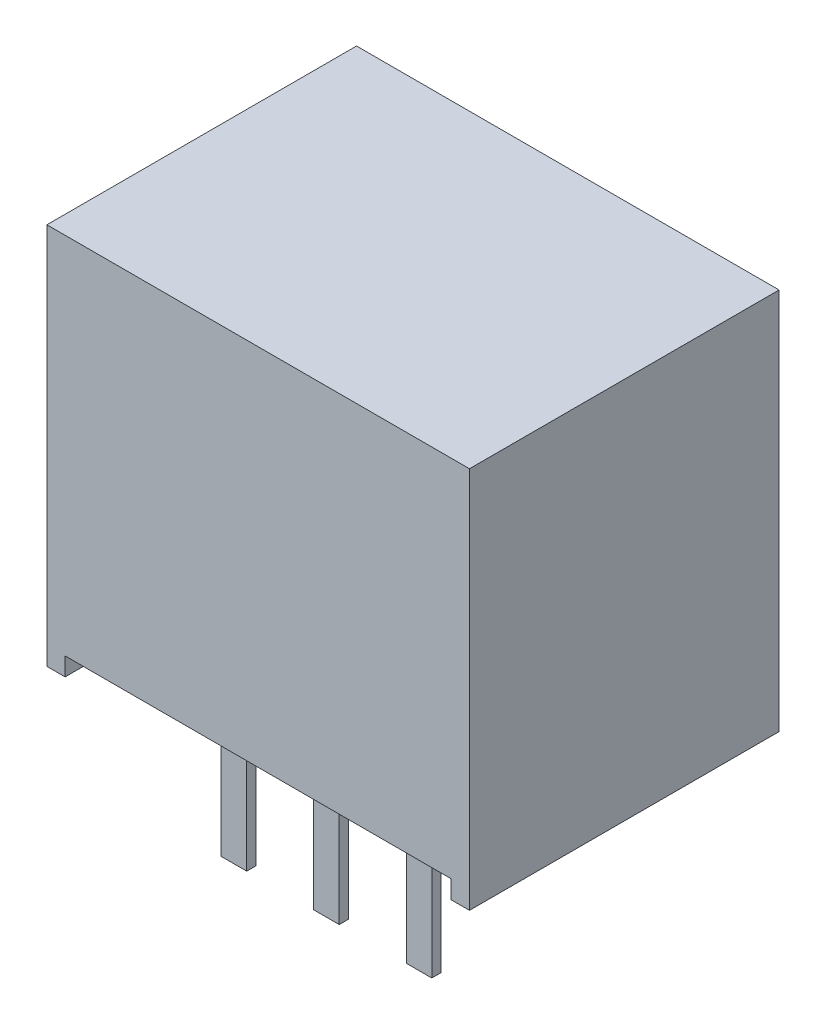
ISO-10303-21;
HEADER;
FILE_DESCRIPTION(('STEP AP214'),'2;1');
FILE_NAME('part.step','',(''),(''),'','','');
FILE_SCHEMA(('AUTOMOTIVE_DESIGN { 1 0 10303 214 1 1 1 1 }'));
ENDSEC;
DATA;
#1=APPLICATION_CONTEXT('core data for automotive mechanical design processes');
#2=APPLICATION_PROTOCOL_DEFINITION('international standard','automotive_design',2000,#1);
#3=PRODUCT_CONTEXT('',#1,'mechanical');
#4=PRODUCT('Part','Part','',(#3));
#5=PRODUCT_RELATED_PRODUCT_CATEGORY('part','',(#4));
#6=PRODUCT_DEFINITION_FORMATION('','',#4);
#7=PRODUCT_DEFINITION_CONTEXT('part definition',#1,'design');
#8=PRODUCT_DEFINITION('design','',#6,#7);
#9=PRODUCT_DEFINITION_SHAPE('','',#8);
#10=(LENGTH_UNIT() NAMED_UNIT(*) SI_UNIT(.MILLI.,.METRE.));
#11=(NAMED_UNIT(*) PLANE_ANGLE_UNIT() SI_UNIT($,.RADIAN.));
#12=(NAMED_UNIT(*) SI_UNIT($,.STERADIAN.) SOLID_ANGLE_UNIT());
#13=UNCERTAINTY_MEASURE_WITH_UNIT(LENGTH_MEASURE(1.E-05),#10,'distance_accuracy_value','');
#14=(GEOMETRIC_REPRESENTATION_CONTEXT(3) GLOBAL_UNCERTAINTY_ASSIGNED_CONTEXT((#13)) GLOBAL_UNIT_ASSIGNED_CONTEXT((#10,
#11,#12)) REPRESENTATION_CONTEXT('',''));
#15=CARTESIAN_POINT('',(0.,0.,0.));
#16=DIRECTION('',(0.,0.,1.));
#17=DIRECTION('',(1.,0.,0.));
#18=AXIS2_PLACEMENT_3D('',#15,#16,#17);
#19=CARTESIAN_POINT('',(-5.3,-4.75,-4.25));
#20=DIRECTION('',(0.,1.,0.));
#21=DIRECTION('',(0.,0.,1.));
#22=AXIS2_PLACEMENT_3D('',#19,#20,#21);
#23=PLANE('',#22);
#24=DIRECTION('',(0.,0.,1.));
#25=VECTOR('',#24,1.);
#26=CARTESIAN_POINT('',(-2.19,-4.75,2.125));
#27=LINE('',#26,#25);
#28=CARTESIAN_POINT('',(-2.19,-4.75,2.125));
#29=VERTEX_POINT('',#28);
#30=CARTESIAN_POINT('',(-2.19,-4.75,2.375));
#31=VERTEX_POINT('',#30);
#32=EDGE_CURVE('E194',#29,#31,#27,.T.);
#33=ORIENTED_EDGE('',*,*,#32,.F.);
#34=DIRECTION('',(1.,0.,0.));
#35=VECTOR('',#34,1.);
#36=CARTESIAN_POINT('',(-2.89,-4.75,2.125));
#37=LINE('',#36,#35);
#38=CARTESIAN_POINT('',(-2.89,-4.75,2.125));
#39=VERTEX_POINT('',#38);
#40=EDGE_CURVE('E207',#39,#29,#37,.T.);
#41=ORIENTED_EDGE('',*,*,#40,.F.);
#42=DIRECTION('',(0.,0.,-1.));
#43=VECTOR('',#42,1.);
#44=CARTESIAN_POINT('',(-2.89,-4.75,2.125));
#45=LINE('',#44,#43);
#46=CARTESIAN_POINT('',(-2.89,-4.75,2.375));
#47=VERTEX_POINT('',#46);
#48=EDGE_CURVE('E216',#47,#39,#45,.T.);
#49=ORIENTED_EDGE('',*,*,#48,.F.);
#50=DIRECTION('',(-1.,0.,0.));
#51=VECTOR('',#50,1.);
#52=CARTESIAN_POINT('',(-2.89,-4.75,2.375));
#53=LINE('',#52,#51);
#54=EDGE_CURVE('E197',#31,#47,#53,.T.);
#55=ORIENTED_EDGE('',*,*,#54,.F.);
#56=EDGE_LOOP('',(#33,#41,#49,#55));
#57=FACE_BOUND('',#56,.T.);
#58=DIRECTION('',(-1.,0.,0.));
#59=VECTOR('',#58,1.);
#60=CARTESIAN_POINT('',(-5.3,-4.75,4.25));
#61=LINE('',#60,#59);
#62=CARTESIAN_POINT('',(5.3,-4.75,4.25));
#63=VERTEX_POINT('',#62);
#64=CARTESIAN_POINT('',(-5.3,-4.75,4.25));
#65=VERTEX_POINT('',#64);
#66=EDGE_CURVE('E270',#63,#65,#61,.T.);
#67=ORIENTED_EDGE('',*,*,#66,.T.);
#68=DIRECTION('',(0.,0.,1.));
#69=VECTOR('',#68,1.);
#70=CARTESIAN_POINT('',(-5.3,-4.75,-4.25));
#71=LINE('',#70,#69);
#72=CARTESIAN_POINT('',(-5.3,-4.75,-4.25));
#73=VERTEX_POINT('',#72);
#74=EDGE_CURVE('E283',#73,#65,#71,.T.);
#75=ORIENTED_EDGE('',*,*,#74,.F.);
#76=DIRECTION('',(-1.,0.,0.));
#77=VECTOR('',#76,1.);
#78=CARTESIAN_POINT('',(-5.3,-4.75,-4.25));
#79=LINE('',#78,#77);
#80=CARTESIAN_POINT('',(5.3,-4.75,-4.25));
#81=VERTEX_POINT('',#80);
#82=EDGE_CURVE('E273',#81,#73,#79,.T.);
#83=ORIENTED_EDGE('',*,*,#82,.F.);
#84=DIRECTION('',(0.,0.,1.));
#85=VECTOR('',#84,1.);
#86=CARTESIAN_POINT('',(5.3,-4.75,-4.25));
#87=LINE('',#86,#85);
#88=EDGE_CURVE('E286',#81,#63,#87,.T.);
#89=ORIENTED_EDGE('',*,*,#88,.T.);
#90=EDGE_LOOP('',(#67,#75,#83,#89));
#91=FACE_BOUND('',#90,.T.);
#92=DIRECTION('',(0.,0.,1.));
#93=VECTOR('',#92,1.);
#94=CARTESIAN_POINT('',(0.35,-4.75,2.375));
#95=LINE('',#94,#93);
#96=CARTESIAN_POINT('',(0.35,-4.75,2.125));
#97=VERTEX_POINT('',#96);
#98=CARTESIAN_POINT('',(0.35,-4.75,2.375));
#99=VERTEX_POINT('',#98);
#100=EDGE_CURVE('E232',#97,#99,#95,.T.);
#101=ORIENTED_EDGE('',*,*,#100,.F.);
#102=DIRECTION('',(1.,0.,0.));
#103=VECTOR('',#102,1.);
#104=CARTESIAN_POINT('',(-0.35,-4.75,2.125));
#105=LINE('',#104,#103);
#106=CARTESIAN_POINT('',(-0.35,-4.75,2.125));
#107=VERTEX_POINT('',#106);
#108=EDGE_CURVE('E237',#107,#97,#105,.T.);
#109=ORIENTED_EDGE('',*,*,#108,.F.);
#110=DIRECTION('',(0.,0.,-1.));
#111=VECTOR('',#110,1.);
#112=CARTESIAN_POINT('',(-0.35,-4.75,2.375));
#113=LINE('',#112,#111);
#114=CARTESIAN_POINT('',(-0.35,-4.75,2.375));
#115=VERTEX_POINT('',#114);
#116=EDGE_CURVE('E249',#115,#107,#113,.T.);
#117=ORIENTED_EDGE('',*,*,#116,.F.);
#118=DIRECTION('',(-1.,0.,0.));
#119=VECTOR('',#118,1.);
#120=CARTESIAN_POINT('',(-0.35,-4.75,2.375));
#121=LINE('',#120,#119);
#122=EDGE_CURVE('E246',#99,#115,#121,.T.);
#123=ORIENTED_EDGE('',*,*,#122,.F.);
#124=EDGE_LOOP('',(#101,#109,#117,#123));
#125=FACE_BOUND('',#124,.T.);
#126=DIRECTION('',(0.,0.,-1.));
#127=VECTOR('',#126,1.);
#128=CARTESIAN_POINT('',(2.19,-4.75,2.125));
#129=LINE('',#128,#127);
#130=CARTESIAN_POINT('',(2.19,-4.75,2.375));
#131=VERTEX_POINT('',#130);
#132=CARTESIAN_POINT('',(2.19,-4.75,2.125));
#133=VERTEX_POINT('',#132);
#134=EDGE_CURVE('E193',#131,#133,#129,.T.);
#135=ORIENTED_EDGE('',*,*,#134,.F.);
#136=DIRECTION('',(-1.,0.,0.));
#137=VECTOR('',#136,1.);
#138=CARTESIAN_POINT('',(2.89,-4.75,2.375));
#139=LINE('',#138,#137);
#140=CARTESIAN_POINT('',(2.89,-4.75,2.375));
#141=VERTEX_POINT('',#140);
#142=EDGE_CURVE('E190',#141,#131,#139,.T.);
#143=ORIENTED_EDGE('',*,*,#142,.F.);
#144=DIRECTION('',(0.,0.,1.));
#145=VECTOR('',#144,1.);
#146=CARTESIAN_POINT('',(2.89,-4.75,2.125));
#147=LINE('',#146,#145);
#148=CARTESIAN_POINT('',(2.89,-4.75,2.125));
#149=VERTEX_POINT('',#148);
#150=EDGE_CURVE('E57',#149,#141,#147,.T.);
#151=ORIENTED_EDGE('',*,*,#150,.F.);
#152=DIRECTION('',(1.,0.,0.));
#153=VECTOR('',#152,1.);
#154=CARTESIAN_POINT('',(2.89,-4.75,2.125));
#155=LINE('',#154,#153);
#156=EDGE_CURVE('E52',#133,#149,#155,.T.);
#157=ORIENTED_EDGE('',*,*,#156,.F.);
#158=EDGE_LOOP('',(#135,#143,#151,#157));
#159=FACE_BOUND('',#158,.T.);
#160=ADVANCED_FACE('F35',(#57,#91,#125,#159),#23,.F.);
#161=CARTESIAN_POINT('',(-5.8,-5.25,4.25));
#162=DIRECTION('',(0.,1.,0.));
#163=DIRECTION('',(0.,0.,1.));
#164=AXIS2_PLACEMENT_3D('',#161,#162,#163);
#165=PLANE('',#164);
#166=DIRECTION('',(1.,0.,0.));
#167=VECTOR('',#166,1.);
#168=CARTESIAN_POINT('',(-5.8,-5.25,-4.25));
#169=LINE('',#168,#167);
#170=CARTESIAN_POINT('',(-5.8,-5.25,-4.25));
#171=VERTEX_POINT('',#170);
#172=CARTESIAN_POINT('',(-5.3,-5.25,-4.25));
#173=VERTEX_POINT('',#172);
#174=EDGE_CURVE('E296',#171,#173,#169,.T.);
#175=ORIENTED_EDGE('',*,*,#174,.T.);
#176=DIRECTION('',(0.,0.,1.));
#177=VECTOR('',#176,1.);
#178=CARTESIAN_POINT('',(-5.3,-5.25,-4.25));
#179=LINE('',#178,#177);
#180=CARTESIAN_POINT('',(-5.3,-5.25,4.25));
#181=VERTEX_POINT('',#180);
#182=EDGE_CURVE('E276',#173,#181,#179,.T.);
#183=ORIENTED_EDGE('',*,*,#182,.T.);
#184=DIRECTION('',(1.,0.,0.));
#185=VECTOR('',#184,1.);
#186=CARTESIAN_POINT('',(-5.8,-5.25,4.25));
#187=LINE('',#186,#185);
#188=CARTESIAN_POINT('',(-5.8,-5.25,4.25));
#189=VERTEX_POINT('',#188);
#190=EDGE_CURVE('E302',#189,#181,#187,.T.);
#191=ORIENTED_EDGE('',*,*,#190,.F.);
#192=DIRECTION('',(0.,0.,-1.));
#193=VECTOR('',#192,1.);
#194=CARTESIAN_POINT('',(-5.8,-5.25,4.25));
#195=LINE('',#194,#193);
#196=EDGE_CURVE('E11',#189,#171,#195,.T.);
#197=ORIENTED_EDGE('',*,*,#196,.T.);
#198=EDGE_LOOP('',(#175,#183,#191,#197));
#199=FACE_BOUND('',#198,.T.);
#200=ADVANCED_FACE('F332',(#199),#165,.F.);
#201=CARTESIAN_POINT('',(-5.8,-5.25,4.25));
#202=DIRECTION('',(-1.,0.,0.));
#203=DIRECTION('',(0.,0.,1.));
#204=AXIS2_PLACEMENT_3D('',#201,#202,#203);
#205=PLANE('',#204);
#206=DIRECTION('',(0.,1.,0.));
#207=VECTOR('',#206,1.);
#208=CARTESIAN_POINT('',(-5.8,-5.25,-4.25));
#209=LINE('',#208,#207);
#210=CARTESIAN_POINT('',(-5.8,5.25,-4.25));
#211=VERTEX_POINT('',#210);
#212=EDGE_CURVE('E285',#171,#211,#209,.T.);
#213=ORIENTED_EDGE('',*,*,#212,.F.);
#214=ORIENTED_EDGE('',*,*,#196,.F.);
#215=DIRECTION('',(0.,1.,0.));
#216=VECTOR('',#215,1.);
#217=CARTESIAN_POINT('',(-5.8,-5.25,4.25));
#218=LINE('',#217,#216);
#219=CARTESIAN_POINT('',(-5.8,5.25,4.25));
#220=VERTEX_POINT('',#219);
#221=EDGE_CURVE('E292',#189,#220,#218,.T.);
#222=ORIENTED_EDGE('',*,*,#221,.T.);
#223=DIRECTION('',(0.,0.,-1.));
#224=VECTOR('',#223,1.);
#225=CARTESIAN_POINT('',(-5.8,5.25,4.25));
#226=LINE('',#225,#224);
#227=EDGE_CURVE('E39',#220,#211,#226,.T.);
#228=ORIENTED_EDGE('',*,*,#227,.T.);
#229=EDGE_LOOP('',(#213,#214,#222,#228));
#230=FACE_BOUND('',#229,.T.);
#231=ADVANCED_FACE('F37',(#230),#205,.T.);
#232=CARTESIAN_POINT('',(5.3,-5.25,4.25));
#233=VERTEX_POINT('',#232);
#234=CARTESIAN_POINT('',(5.8,-5.25,4.25));
#235=VERTEX_POINT('',#234);
#236=EDGE_CURVE('E301',#233,#235,#187,.T.);
#237=ORIENTED_EDGE('',*,*,#236,.F.);
#238=DIRECTION('',(0.,0.,1.));
#239=VECTOR('',#238,1.);
#240=CARTESIAN_POINT('',(5.3,-5.25,-4.25));
#241=LINE('',#240,#239);
#242=CARTESIAN_POINT('',(5.3,-5.25,-4.25));
#243=VERTEX_POINT('',#242);
#244=EDGE_CURVE('E288',#243,#233,#241,.T.);
#245=ORIENTED_EDGE('',*,*,#244,.F.);
#246=CARTESIAN_POINT('',(5.8,-5.25,-4.25));
#247=VERTEX_POINT('',#246);
#248=EDGE_CURVE('E313',#243,#247,#169,.T.);
#249=ORIENTED_EDGE('',*,*,#248,.T.);
#250=DIRECTION('',(0.,0.,-1.));
#251=VECTOR('',#250,1.);
#252=CARTESIAN_POINT('',(5.8,-5.25,4.25));
#253=LINE('',#252,#251);
#254=EDGE_CURVE('E44',#235,#247,#253,.T.);
#255=ORIENTED_EDGE('',*,*,#254,.F.);
#256=EDGE_LOOP('',(#237,#245,#249,#255));
#257=FACE_BOUND('',#256,.T.);
#258=ADVANCED_FACE('F346',(#257),#165,.F.);
#259=CARTESIAN_POINT('',(5.8,-5.25,4.25));
#260=DIRECTION('',(-1.,0.,0.));
#261=DIRECTION('',(0.,0.,1.));
#262=AXIS2_PLACEMENT_3D('',#259,#260,#261);
#263=PLANE('',#262);
#264=DIRECTION('',(0.,1.,0.));
#265=VECTOR('',#264,1.);
#266=CARTESIAN_POINT('',(5.8,-5.25,-4.25));
#267=LINE('',#266,#265);
#268=CARTESIAN_POINT('',(5.8,5.25,-4.25));
#269=VERTEX_POINT('',#268);
#270=EDGE_CURVE('E310',#247,#269,#267,.T.);
#271=ORIENTED_EDGE('',*,*,#270,.T.);
#272=DIRECTION('',(0.,0.,-1.));
#273=VECTOR('',#272,1.);
#274=CARTESIAN_POINT('',(5.8,5.25,4.25));
#275=LINE('',#274,#273);
#276=CARTESIAN_POINT('',(5.8,5.25,4.25));
#277=VERTEX_POINT('',#276);
#278=EDGE_CURVE('E317',#277,#269,#275,.T.);
#279=ORIENTED_EDGE('',*,*,#278,.F.);
#280=DIRECTION('',(0.,1.,0.));
#281=VECTOR('',#280,1.);
#282=CARTESIAN_POINT('',(5.8,-5.25,4.25));
#283=LINE('',#282,#281);
#284=EDGE_CURVE('E299',#235,#277,#283,.T.);
#285=ORIENTED_EDGE('',*,*,#284,.F.);
#286=ORIENTED_EDGE('',*,*,#254,.T.);
#287=EDGE_LOOP('',(#271,#279,#285,#286));
#288=FACE_BOUND('',#287,.T.);
#289=ADVANCED_FACE('F342',(#288),#263,.F.);
#290=CARTESIAN_POINT('',(-5.8,5.25,4.25));
#291=DIRECTION('',(0.,1.,0.));
#292=DIRECTION('',(0.,0.,1.));
#293=AXIS2_PLACEMENT_3D('',#290,#291,#292);
#294=PLANE('',#293);
#295=DIRECTION('',(1.,0.,0.));
#296=VECTOR('',#295,1.);
#297=CARTESIAN_POINT('',(-5.8,5.25,-4.25));
#298=LINE('',#297,#296);
#299=EDGE_CURVE('E307',#211,#269,#298,.T.);
#300=ORIENTED_EDGE('',*,*,#299,.F.);
#301=ORIENTED_EDGE('',*,*,#227,.F.);
#302=DIRECTION('',(1.,0.,0.));
#303=VECTOR('',#302,1.);
#304=CARTESIAN_POINT('',(-5.8,5.25,4.25));
#305=LINE('',#304,#303);
#306=EDGE_CURVE('E295',#220,#277,#305,.T.);
#307=ORIENTED_EDGE('',*,*,#306,.T.);
#308=ORIENTED_EDGE('',*,*,#278,.T.);
#309=EDGE_LOOP('',(#300,#301,#307,#308));
#310=FACE_BOUND('',#309,.T.);
#311=ADVANCED_FACE('F325',(#310),#294,.T.);
#312=CARTESIAN_POINT('',(0.,0.,4.25));
#313=DIRECTION('',(0.,0.,-1.));
#314=DIRECTION('',(-1.,0.,0.));
#315=AXIS2_PLACEMENT_3D('',#312,#313,#314);
#316=PLANE('',#315);
#317=ORIENTED_EDGE('',*,*,#190,.T.);
#318=DIRECTION('',(0.,-1.,0.));
#319=VECTOR('',#318,1.);
#320=CARTESIAN_POINT('',(-5.3,-5.25,4.25));
#321=LINE('',#320,#319);
#322=EDGE_CURVE('E265',#65,#181,#321,.T.);
#323=ORIENTED_EDGE('',*,*,#322,.F.);
#324=ORIENTED_EDGE('',*,*,#66,.F.);
#325=DIRECTION('',(0.,1.,0.));
#326=VECTOR('',#325,1.);
#327=CARTESIAN_POINT('',(5.3,-5.25,4.25));
#328=LINE('',#327,#326);
#329=EDGE_CURVE('E278',#233,#63,#328,.T.);
#330=ORIENTED_EDGE('',*,*,#329,.F.);
#331=ORIENTED_EDGE('',*,*,#236,.T.);
#332=ORIENTED_EDGE('',*,*,#284,.T.);
#333=ORIENTED_EDGE('',*,*,#306,.F.);
#334=ORIENTED_EDGE('',*,*,#221,.F.);
#335=EDGE_LOOP('',(#317,#323,#324,#330,#331,#332,#333,#334));
#336=FACE_BOUND('',#335,.T.);
#337=ADVANCED_FACE('F336',(#336),#316,.F.);
#338=CARTESIAN_POINT('',(0.,0.,-4.25));
#339=DIRECTION('',(0.,0.,-1.));
#340=DIRECTION('',(-1.,0.,0.));
#341=AXIS2_PLACEMENT_3D('',#338,#339,#340);
#342=PLANE('',#341);
#343=DIRECTION('',(0.,-1.,0.));
#344=VECTOR('',#343,1.);
#345=CARTESIAN_POINT('',(-5.3,-5.25,-4.25));
#346=LINE('',#345,#344);
#347=EDGE_CURVE('E266',#73,#173,#346,.T.);
#348=ORIENTED_EDGE('',*,*,#347,.T.);
#349=ORIENTED_EDGE('',*,*,#174,.F.);
#350=ORIENTED_EDGE('',*,*,#212,.T.);
#351=ORIENTED_EDGE('',*,*,#299,.T.);
#352=ORIENTED_EDGE('',*,*,#270,.F.);
#353=ORIENTED_EDGE('',*,*,#248,.F.);
#354=DIRECTION('',(0.,1.,0.));
#355=VECTOR('',#354,1.);
#356=CARTESIAN_POINT('',(5.3,-5.25,-4.25));
#357=LINE('',#356,#355);
#358=EDGE_CURVE('E269',#243,#81,#357,.T.);
#359=ORIENTED_EDGE('',*,*,#358,.T.);
#360=ORIENTED_EDGE('',*,*,#82,.T.);
#361=EDGE_LOOP('',(#348,#349,#350,#351,#352,#353,#359,#360));
#362=FACE_BOUND('',#361,.T.);
#363=ADVANCED_FACE('F329',(#362),#342,.T.);
#364=CARTESIAN_POINT('',(-5.3,-5.25,-4.25));
#365=DIRECTION('',(-1.,0.,0.));
#366=DIRECTION('',(0.,0.,1.));
#367=AXIS2_PLACEMENT_3D('',#364,#365,#366);
#368=PLANE('',#367);
#369=ORIENTED_EDGE('',*,*,#322,.T.);
#370=ORIENTED_EDGE('',*,*,#182,.F.);
#371=ORIENTED_EDGE('',*,*,#347,.F.);
#372=ORIENTED_EDGE('',*,*,#74,.T.);
#373=EDGE_LOOP('',(#369,#370,#371,#372));
#374=FACE_BOUND('',#373,.T.);
#375=ADVANCED_FACE('F354',(#374),#368,.F.);
#376=CARTESIAN_POINT('',(5.3,-5.25,-4.25));
#377=DIRECTION('',(1.,0.,0.));
#378=DIRECTION('',(0.,0.,-1.));
#379=AXIS2_PLACEMENT_3D('',#376,#377,#378);
#380=PLANE('',#379);
#381=ORIENTED_EDGE('',*,*,#329,.T.);
#382=ORIENTED_EDGE('',*,*,#88,.F.);
#383=ORIENTED_EDGE('',*,*,#358,.F.);
#384=ORIENTED_EDGE('',*,*,#244,.T.);
#385=EDGE_LOOP('',(#381,#382,#383,#384));
#386=FACE_BOUND('',#385,.T.);
#387=ADVANCED_FACE('F348',(#386),#380,.F.);
#388=CARTESIAN_POINT('',(0.35,-9.25,2.375));
#389=DIRECTION('',(-1.,0.,0.));
#390=DIRECTION('',(0.,0.,1.));
#391=AXIS2_PLACEMENT_3D('',#388,#389,#390);
#392=PLANE('',#391);
#393=ORIENTED_EDGE('',*,*,#100,.T.);
#394=DIRECTION('',(0.,1.,0.));
#395=VECTOR('',#394,1.);
#396=CARTESIAN_POINT('',(0.35,-9.25,2.375));
#397=LINE('',#396,#395);
#398=CARTESIAN_POINT('',(0.35,-9.25,2.375));
#399=VERTEX_POINT('',#398);
#400=EDGE_CURVE('E262',#399,#99,#397,.T.);
#401=ORIENTED_EDGE('',*,*,#400,.F.);
#402=DIRECTION('',(0.,0.,1.));
#403=VECTOR('',#402,1.);
#404=CARTESIAN_POINT('',(0.35,-9.25,2.375));
#405=LINE('',#404,#403);
#406=CARTESIAN_POINT('',(0.35,-9.25,2.125));
#407=VERTEX_POINT('',#406);
#408=EDGE_CURVE('E233',#407,#399,#405,.T.);
#409=ORIENTED_EDGE('',*,*,#408,.F.);
#410=DIRECTION('',(0.,1.,0.));
#411=VECTOR('',#410,1.);
#412=CARTESIAN_POINT('',(0.35,-9.25,2.125));
#413=LINE('',#412,#411);
#414=EDGE_CURVE('E243',#407,#97,#413,.T.);
#415=ORIENTED_EDGE('',*,*,#414,.T.);
#416=EDGE_LOOP('',(#393,#401,#409,#415));
#417=FACE_BOUND('',#416,.T.);
#418=ADVANCED_FACE('F361',(#417),#392,.F.);
#419=CARTESIAN_POINT('',(-0.35,-9.25,2.375));
#420=DIRECTION('',(0.,0.,-1.));
#421=DIRECTION('',(-1.,0.,0.));
#422=AXIS2_PLACEMENT_3D('',#419,#420,#421);
#423=PLANE('',#422);
#424=ORIENTED_EDGE('',*,*,#122,.T.);
#425=DIRECTION('',(0.,1.,0.));
#426=VECTOR('',#425,1.);
#427=CARTESIAN_POINT('',(-0.35,-9.25,2.375));
#428=LINE('',#427,#426);
#429=CARTESIAN_POINT('',(-0.35,-9.25,2.375));
#430=VERTEX_POINT('',#429);
#431=EDGE_CURVE('E259',#430,#115,#428,.T.);
#432=ORIENTED_EDGE('',*,*,#431,.F.);
#433=DIRECTION('',(-1.,0.,0.));
#434=VECTOR('',#433,1.);
#435=CARTESIAN_POINT('',(-0.35,-9.25,2.375));
#436=LINE('',#435,#434);
#437=EDGE_CURVE('E236',#399,#430,#436,.T.);
#438=ORIENTED_EDGE('',*,*,#437,.F.);
#439=ORIENTED_EDGE('',*,*,#400,.T.);
#440=EDGE_LOOP('',(#424,#432,#438,#439));
#441=FACE_BOUND('',#440,.T.);
#442=ADVANCED_FACE('F375',(#441),#423,.F.);
#443=CARTESIAN_POINT('',(-0.35,-9.25,2.375));
#444=DIRECTION('',(1.,0.,0.));
#445=DIRECTION('',(0.,0.,-1.));
#446=AXIS2_PLACEMENT_3D('',#443,#444,#445);
#447=PLANE('',#446);
#448=ORIENTED_EDGE('',*,*,#116,.T.);
#449=DIRECTION('',(0.,1.,0.));
#450=VECTOR('',#449,1.);
#451=CARTESIAN_POINT('',(-0.35,-9.25,2.125));
#452=LINE('',#451,#450);
#453=CARTESIAN_POINT('',(-0.35,-9.25,2.125));
#454=VERTEX_POINT('',#453);
#455=EDGE_CURVE('E256',#454,#107,#452,.T.);
#456=ORIENTED_EDGE('',*,*,#455,.F.);
#457=DIRECTION('',(0.,0.,-1.));
#458=VECTOR('',#457,1.);
#459=CARTESIAN_POINT('',(-0.35,-9.25,2.375));
#460=LINE('',#459,#458);
#461=EDGE_CURVE('E239',#430,#454,#460,.T.);
#462=ORIENTED_EDGE('',*,*,#461,.F.);
#463=ORIENTED_EDGE('',*,*,#431,.T.);
#464=EDGE_LOOP('',(#448,#456,#462,#463));
#465=FACE_BOUND('',#464,.T.);
#466=ADVANCED_FACE('F379',(#465),#447,.F.);
#467=CARTESIAN_POINT('',(-0.35,-9.25,2.125));
#468=DIRECTION('',(0.,0.,1.));
#469=DIRECTION('',(1.,0.,0.));
#470=AXIS2_PLACEMENT_3D('',#467,#468,#469);
#471=PLANE('',#470);
#472=ORIENTED_EDGE('',*,*,#108,.T.);
#473=ORIENTED_EDGE('',*,*,#414,.F.);
#474=DIRECTION('',(1.,0.,0.));
#475=VECTOR('',#474,1.);
#476=CARTESIAN_POINT('',(-0.35,-9.25,2.125));
#477=LINE('',#476,#475);
#478=EDGE_CURVE('E241',#454,#407,#477,.T.);
#479=ORIENTED_EDGE('',*,*,#478,.F.);
#480=ORIENTED_EDGE('',*,*,#455,.T.);
#481=EDGE_LOOP('',(#472,#473,#479,#480));
#482=FACE_BOUND('',#481,.T.);
#483=ADVANCED_FACE('F383',(#482),#471,.F.);
#484=CARTESIAN_POINT('',(0.,-9.25,0.));
#485=DIRECTION('',(0.,-1.,0.));
#486=DIRECTION('',(0.,0.,-1.));
#487=AXIS2_PLACEMENT_3D('',#484,#485,#486);
#488=PLANE('',#487);
#489=ORIENTED_EDGE('',*,*,#408,.T.);
#490=ORIENTED_EDGE('',*,*,#437,.T.);
#491=ORIENTED_EDGE('',*,*,#461,.T.);
#492=ORIENTED_EDGE('',*,*,#478,.T.);
#493=EDGE_LOOP('',(#489,#490,#491,#492));
#494=FACE_BOUND('',#493,.T.);
#495=ADVANCED_FACE('F387',(#494),#488,.T.);
#496=CARTESIAN_POINT('',(-2.19,-9.25,2.125));
#497=DIRECTION('',(-1.,0.,0.));
#498=DIRECTION('',(0.,0.,1.));
#499=AXIS2_PLACEMENT_3D('',#496,#497,#498);
#500=PLANE('',#499);
#501=ORIENTED_EDGE('',*,*,#32,.T.);
#502=DIRECTION('',(0.,1.,0.));
#503=VECTOR('',#502,1.);
#504=CARTESIAN_POINT('',(-2.19,-9.25,2.375));
#505=LINE('',#504,#503);
#506=CARTESIAN_POINT('',(-2.19,-9.25,2.375));
#507=VERTEX_POINT('',#506);
#508=EDGE_CURVE('E229',#507,#31,#505,.T.);
#509=ORIENTED_EDGE('',*,*,#508,.F.);
#510=DIRECTION('',(0.,0.,1.));
#511=VECTOR('',#510,1.);
#512=CARTESIAN_POINT('',(-2.19,-9.25,2.125));
#513=LINE('',#512,#511);
#514=CARTESIAN_POINT('',(-2.19,-9.25,2.125));
#515=VERTEX_POINT('',#514);
#516=EDGE_CURVE('E203',#515,#507,#513,.T.);
#517=ORIENTED_EDGE('',*,*,#516,.F.);
#518=DIRECTION('',(0.,1.,0.));
#519=VECTOR('',#518,1.);
#520=CARTESIAN_POINT('',(-2.19,-9.25,2.125));
#521=LINE('',#520,#519);
#522=EDGE_CURVE('E212',#515,#29,#521,.T.);
#523=ORIENTED_EDGE('',*,*,#522,.T.);
#524=EDGE_LOOP('',(#501,#509,#517,#523));
#525=FACE_BOUND('',#524,.T.);
#526=ADVANCED_FACE('F391',(#525),#500,.F.);
#527=CARTESIAN_POINT('',(-2.89,-9.25,2.375));
#528=DIRECTION('',(0.,0.,-1.));
#529=DIRECTION('',(-1.,0.,0.));
#530=AXIS2_PLACEMENT_3D('',#527,#528,#529);
#531=PLANE('',#530);
#532=ORIENTED_EDGE('',*,*,#54,.T.);
#533=DIRECTION('',(0.,1.,0.));
#534=VECTOR('',#533,1.);
#535=CARTESIAN_POINT('',(-2.89,-9.25,2.375));
#536=LINE('',#535,#534);
#537=CARTESIAN_POINT('',(-2.89,-9.25,2.375));
#538=VERTEX_POINT('',#537);
#539=EDGE_CURVE('E226',#538,#47,#536,.T.);
#540=ORIENTED_EDGE('',*,*,#539,.F.);
#541=DIRECTION('',(-1.,0.,0.));
#542=VECTOR('',#541,1.);
#543=CARTESIAN_POINT('',(-2.89,-9.25,2.375));
#544=LINE('',#543,#542);
#545=EDGE_CURVE('E206',#507,#538,#544,.T.);
#546=ORIENTED_EDGE('',*,*,#545,.F.);
#547=ORIENTED_EDGE('',*,*,#508,.T.);
#548=EDGE_LOOP('',(#532,#540,#546,#547));
#549=FACE_BOUND('',#548,.T.);
#550=ADVANCED_FACE('F395',(#549),#531,.F.);
#551=CARTESIAN_POINT('',(-2.89,-9.25,2.125));
#552=DIRECTION('',(1.,0.,0.));
#553=DIRECTION('',(0.,0.,-1.));
#554=AXIS2_PLACEMENT_3D('',#551,#552,#553);
#555=PLANE('',#554);
#556=ORIENTED_EDGE('',*,*,#48,.T.);
#557=DIRECTION('',(0.,1.,0.));
#558=VECTOR('',#557,1.);
#559=CARTESIAN_POINT('',(-2.89,-9.25,2.125));
#560=LINE('',#559,#558);
#561=CARTESIAN_POINT('',(-2.89,-9.25,2.125));
#562=VERTEX_POINT('',#561);
#563=EDGE_CURVE('E223',#562,#39,#560,.T.);
#564=ORIENTED_EDGE('',*,*,#563,.F.);
#565=DIRECTION('',(0.,0.,-1.));
#566=VECTOR('',#565,1.);
#567=CARTESIAN_POINT('',(-2.89,-9.25,2.125));
#568=LINE('',#567,#566);
#569=EDGE_CURVE('E209',#538,#562,#568,.T.);
#570=ORIENTED_EDGE('',*,*,#569,.F.);
#571=ORIENTED_EDGE('',*,*,#539,.T.);
#572=EDGE_LOOP('',(#556,#564,#570,#571));
#573=FACE_BOUND('',#572,.T.);
#574=ADVANCED_FACE('F399',(#573),#555,.F.);
#575=CARTESIAN_POINT('',(-2.89,-9.25,2.125));
#576=DIRECTION('',(0.,0.,1.));
#577=DIRECTION('',(1.,0.,0.));
#578=AXIS2_PLACEMENT_3D('',#575,#576,#577);
#579=PLANE('',#578);
#580=ORIENTED_EDGE('',*,*,#40,.T.);
#581=ORIENTED_EDGE('',*,*,#522,.F.);
#582=DIRECTION('',(1.,0.,0.));
#583=VECTOR('',#582,1.);
#584=CARTESIAN_POINT('',(-2.89,-9.25,2.125));
#585=LINE('',#584,#583);
#586=EDGE_CURVE('E211',#562,#515,#585,.T.);
#587=ORIENTED_EDGE('',*,*,#586,.F.);
#588=ORIENTED_EDGE('',*,*,#563,.T.);
#589=EDGE_LOOP('',(#580,#581,#587,#588));
#590=FACE_BOUND('',#589,.T.);
#591=ADVANCED_FACE('F403',(#590),#579,.F.);
#592=CARTESIAN_POINT('',(0.,-9.25,0.));
#593=DIRECTION('',(0.,1.,0.));
#594=DIRECTION('',(0.,0.,1.));
#595=AXIS2_PLACEMENT_3D('',#592,#593,#594);
#596=PLANE('',#595);
#597=ORIENTED_EDGE('',*,*,#516,.T.);
#598=ORIENTED_EDGE('',*,*,#545,.T.);
#599=ORIENTED_EDGE('',*,*,#569,.T.);
#600=ORIENTED_EDGE('',*,*,#586,.T.);
#601=EDGE_LOOP('',(#597,#598,#599,#600));
#602=FACE_BOUND('',#601,.T.);
#603=ADVANCED_FACE('F407',(#602),#596,.F.);
#604=CARTESIAN_POINT('',(2.19,-9.25,2.125));
#605=DIRECTION('',(1.,0.,0.));
#606=DIRECTION('',(0.,0.,-1.));
#607=AXIS2_PLACEMENT_3D('',#604,#605,#606);
#608=PLANE('',#607);
#609=ORIENTED_EDGE('',*,*,#134,.T.);
#610=DIRECTION('',(0.,1.,0.));
#611=VECTOR('',#610,1.);
#612=CARTESIAN_POINT('',(2.19,-9.25,2.125));
#613=LINE('',#612,#611);
#614=CARTESIAN_POINT('',(2.19,-9.25,2.125));
#615=VERTEX_POINT('',#614);
#616=EDGE_CURVE('E174',#615,#133,#613,.T.);
#617=ORIENTED_EDGE('',*,*,#616,.F.);
#618=DIRECTION('',(0.,0.,-1.));
#619=VECTOR('',#618,1.);
#620=CARTESIAN_POINT('',(2.19,-9.25,2.125));
#621=LINE('',#620,#619);
#622=CARTESIAN_POINT('',(2.19,-9.25,2.375));
#623=VERTEX_POINT('',#622);
#624=EDGE_CURVE('E181',#623,#615,#621,.T.);
#625=ORIENTED_EDGE('',*,*,#624,.F.);
#626=DIRECTION('',(0.,1.,0.));
#627=VECTOR('',#626,1.);
#628=CARTESIAN_POINT('',(2.19,-9.25,2.375));
#629=LINE('',#628,#627);
#630=EDGE_CURVE('E579',#623,#131,#629,.T.);
#631=ORIENTED_EDGE('',*,*,#630,.T.);
#632=EDGE_LOOP('',(#609,#617,#625,#631));
#633=FACE_BOUND('',#632,.T.);
#634=ADVANCED_FACE('F192',(#633),#608,.F.);
#635=CARTESIAN_POINT('',(2.89,-9.25,2.125));
#636=DIRECTION('',(0.,0.,1.));
#637=DIRECTION('',(1.,0.,0.));
#638=AXIS2_PLACEMENT_3D('',#635,#636,#637);
#639=PLANE('',#638);
#640=ORIENTED_EDGE('',*,*,#156,.T.);
#641=DIRECTION('',(0.,1.,0.));
#642=VECTOR('',#641,1.);
#643=CARTESIAN_POINT('',(2.89,-9.25,2.125));
#644=LINE('',#643,#642);
#645=CARTESIAN_POINT('',(2.89,-9.25,2.125));
#646=VERTEX_POINT('',#645);
#647=EDGE_CURVE('E177',#646,#149,#644,.T.);
#648=ORIENTED_EDGE('',*,*,#647,.F.);
#649=DIRECTION('',(1.,0.,0.));
#650=VECTOR('',#649,1.);
#651=CARTESIAN_POINT('',(2.89,-9.25,2.125));
#652=LINE('',#651,#650);
#653=EDGE_CURVE('E170',#615,#646,#652,.T.);
#654=ORIENTED_EDGE('',*,*,#653,.F.);
#655=ORIENTED_EDGE('',*,*,#616,.T.);
#656=EDGE_LOOP('',(#640,#648,#654,#655));
#657=FACE_BOUND('',#656,.T.);
#658=ADVANCED_FACE('F172',(#657),#639,.F.);
#659=CARTESIAN_POINT('',(2.89,-9.25,2.125));
#660=DIRECTION('',(-1.,0.,0.));
#661=DIRECTION('',(0.,0.,1.));
#662=AXIS2_PLACEMENT_3D('',#659,#660,#661);
#663=PLANE('',#662);
#664=ORIENTED_EDGE('',*,*,#150,.T.);
#665=DIRECTION('',(0.,1.,0.));
#666=VECTOR('',#665,1.);
#667=CARTESIAN_POINT('',(2.89,-9.25,2.375));
#668=LINE('',#667,#666);
#669=CARTESIAN_POINT('',(2.89,-9.25,2.375));
#670=VERTEX_POINT('',#669);
#671=EDGE_CURVE('E199',#670,#141,#668,.T.);
#672=ORIENTED_EDGE('',*,*,#671,.F.);
#673=DIRECTION('',(0.,0.,1.));
#674=VECTOR('',#673,1.);
#675=CARTESIAN_POINT('',(2.89,-9.25,2.125));
#676=LINE('',#675,#674);
#677=EDGE_CURVE('E180',#646,#670,#676,.T.);
#678=ORIENTED_EDGE('',*,*,#677,.F.);
#679=ORIENTED_EDGE('',*,*,#647,.T.);
#680=EDGE_LOOP('',(#664,#672,#678,#679));
#681=FACE_BOUND('',#680,.T.);
#682=ADVANCED_FACE('F416',(#681),#663,.F.);
#683=CARTESIAN_POINT('',(2.89,-9.25,2.375));
#684=DIRECTION('',(0.,0.,-1.));
#685=DIRECTION('',(-1.,0.,0.));
#686=AXIS2_PLACEMENT_3D('',#683,#684,#685);
#687=PLANE('',#686);
#688=ORIENTED_EDGE('',*,*,#142,.T.);
#689=ORIENTED_EDGE('',*,*,#630,.F.);
#690=DIRECTION('',(-1.,0.,0.));
#691=VECTOR('',#690,1.);
#692=CARTESIAN_POINT('',(2.89,-9.25,2.375));
#693=LINE('',#692,#691);
#694=EDGE_CURVE('E186',#670,#623,#693,.T.);
#695=ORIENTED_EDGE('',*,*,#694,.F.);
#696=ORIENTED_EDGE('',*,*,#671,.T.);
#697=EDGE_LOOP('',(#688,#689,#695,#696));
#698=FACE_BOUND('',#697,.T.);
#699=ADVANCED_FACE('F419',(#698),#687,.F.);
#700=CARTESIAN_POINT('',(0.,-9.25,0.));
#701=DIRECTION('',(0.,-1.,0.));
#702=DIRECTION('',(0.,0.,-1.));
#703=AXIS2_PLACEMENT_3D('',#700,#701,#702);
#704=PLANE('',#703);
#705=ORIENTED_EDGE('',*,*,#624,.T.);
#706=ORIENTED_EDGE('',*,*,#653,.T.);
#707=ORIENTED_EDGE('',*,*,#677,.T.);
#708=ORIENTED_EDGE('',*,*,#694,.T.);
#709=EDGE_LOOP('',(#705,#706,#707,#708));
#710=FACE_BOUND('',#709,.T.);
#711=ADVANCED_FACE('F184',(#710),#704,.T.);
#712=CLOSED_SHELL('',(#160,#200,#231,#258,#289,#311,#337,#363,#375,#387,#418,#442,#466,#483,
#495,#526,#550,#574,#591,#603,#634,#658,#682,#699,#711));
#713=MANIFOLD_SOLID_BREP('B2',#712);
#714=ADVANCED_BREP_SHAPE_REPRESENTATION('',(#18,#713),#14);
#715=SHAPE_DEFINITION_REPRESENTATION(#9,#714);
ENDSEC;
END-ISO-10303-21;
